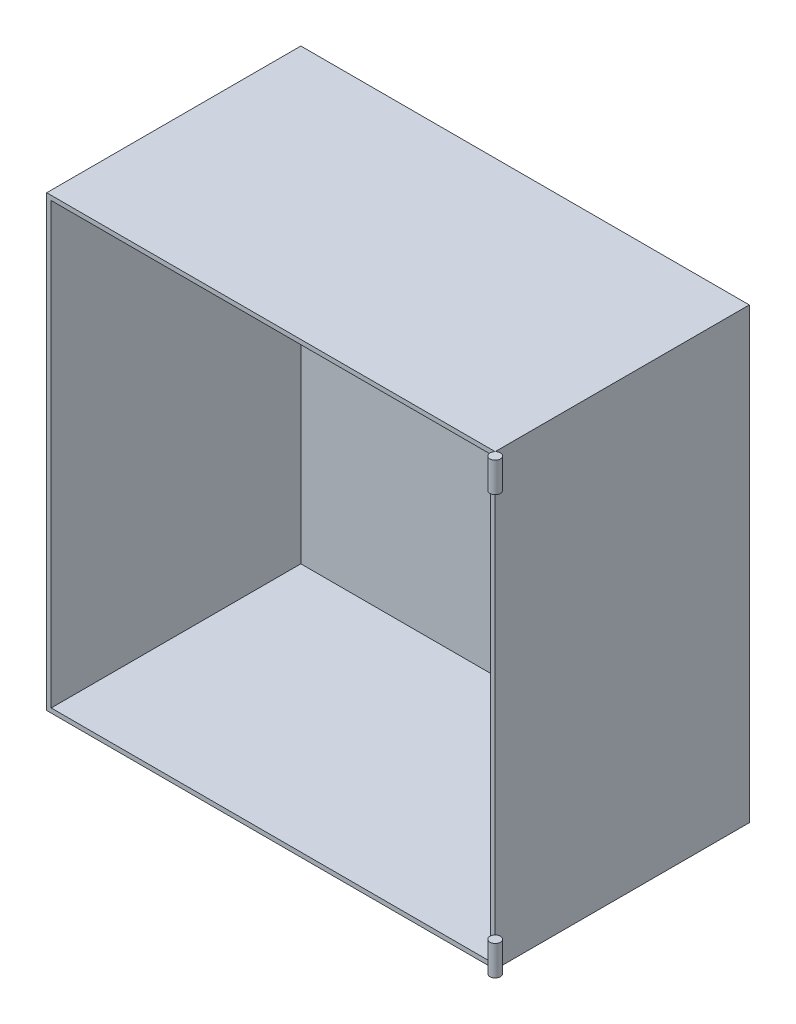
ISO-10303-21;
HEADER;
FILE_DESCRIPTION(('STEP AP214'),'2;1');
FILE_NAME('part.step','',(''),(''),'','','');
FILE_SCHEMA(('AUTOMOTIVE_DESIGN { 1 0 10303 214 1 1 1 1 }'));
ENDSEC;
DATA;
#1=APPLICATION_CONTEXT('core data for automotive mechanical design processes');
#2=APPLICATION_PROTOCOL_DEFINITION('international standard','automotive_design',2000,#1);
#3=PRODUCT_CONTEXT('',#1,'mechanical');
#4=PRODUCT('Part','Part','',(#3));
#5=PRODUCT_RELATED_PRODUCT_CATEGORY('part','',(#4));
#6=PRODUCT_DEFINITION_FORMATION('','',#4);
#7=PRODUCT_DEFINITION_CONTEXT('part definition',#1,'design');
#8=PRODUCT_DEFINITION('design','',#6,#7);
#9=PRODUCT_DEFINITION_SHAPE('','',#8);
#10=(LENGTH_UNIT() NAMED_UNIT(*) SI_UNIT(.MILLI.,.METRE.));
#11=(NAMED_UNIT(*) PLANE_ANGLE_UNIT() SI_UNIT($,.RADIAN.));
#12=(NAMED_UNIT(*) SI_UNIT($,.STERADIAN.) SOLID_ANGLE_UNIT());
#13=UNCERTAINTY_MEASURE_WITH_UNIT(LENGTH_MEASURE(1.E-05),#10,'distance_accuracy_value','');
#14=(GEOMETRIC_REPRESENTATION_CONTEXT(3) GLOBAL_UNCERTAINTY_ASSIGNED_CONTEXT((#13)) GLOBAL_UNIT_ASSIGNED_CONTEXT((#10,
#11,#12)) REPRESENTATION_CONTEXT('',''));
#15=CARTESIAN_POINT('',(0.,0.,0.));
#16=DIRECTION('',(0.,0.,1.));
#17=DIRECTION('',(1.,0.,0.));
#18=AXIS2_PLACEMENT_3D('',#15,#16,#17);
#19=CARTESIAN_POINT('',(302.474873734153,-280.,172.474873734153));
#20=DIRECTION('',(0.,-1.,0.));
#21=DIRECTION('',(1.,0.,0.));
#22=AXIS2_PLACEMENT_3D('',#19,#20,#21);
#23=CYLINDRICAL_SURFACE('',#22,3.49999999999997);
#24=CARTESIAN_POINT('',(302.474873734153,-280.,172.474873734153));
#25=DIRECTION('',(0.,-1.,0.));
#26=DIRECTION('',(1.,0.,0.));
#27=AXIS2_PLACEMENT_3D('',#24,#25,#26);
#28=CIRCLE('',#27,3.49999999999997);
#29=CARTESIAN_POINT('',(305.974873734153,-280.,172.474873734153));
#30=VERTEX_POINT('',#29);
#31=EDGE_CURVE('E11',#30,#30,#28,.T.);
#32=ORIENTED_EDGE('',*,*,#31,.T.);
#33=EDGE_LOOP('',(#32));
#34=FACE_BOUND('',#33,.T.);
#35=CARTESIAN_POINT('',(302.474873734153,-300.,172.474873734153));
#36=DIRECTION('',(0.,-1.,0.));
#37=DIRECTION('',(1.,0.,0.));
#38=AXIS2_PLACEMENT_3D('',#35,#36,#37);
#39=CIRCLE('',#38,3.49999999999997);
#40=CARTESIAN_POINT('',(305.974873734153,-300.,172.474873734153));
#41=VERTEX_POINT('',#40);
#42=EDGE_CURVE('E43',#41,#41,#39,.T.);
#43=ORIENTED_EDGE('',*,*,#42,.F.);
#44=EDGE_LOOP('',(#43));
#45=FACE_BOUND('',#44,.T.);
#46=ADVANCED_FACE('F40',(#34,#45),#23,.T.);
#47=CARTESIAN_POINT('',(302.474873734153,-280.,172.474873734153));
#48=DIRECTION('',(0.,-1.,0.));
#49=DIRECTION('',(1.,0.,0.));
#50=AXIS2_PLACEMENT_3D('',#47,#48,#49);
#51=PLANE('',#50);
#52=ORIENTED_EDGE('',*,*,#31,.F.);
#53=EDGE_LOOP('',(#52));
#54=FACE_BOUND('',#53,.T.);
#55=ADVANCED_FACE('F55',(#54),#51,.F.);
#56=CARTESIAN_POINT('',(302.474873734153,-300.,172.474873734153));
#57=DIRECTION('',(0.,-1.,0.));
#58=DIRECTION('',(1.,0.,0.));
#59=AXIS2_PLACEMENT_3D('',#56,#57,#58);
#60=PLANE('',#59);
#61=ORIENTED_EDGE('',*,*,#42,.T.);
#62=EDGE_LOOP('',(#61));
#63=FACE_BOUND('',#62,.T.);
#64=ADVANCED_FACE('F52',(#63),#60,.T.);
#65=CLOSED_SHELL('',(#46,#55,#64));
#66=MANIFOLD_SOLID_BREP('B2',#65);
#67=CARTESIAN_POINT('',(302.474873734153,-20.,172.474873734153));
#68=DIRECTION('',(0.,1.,0.));
#69=DIRECTION('',(0.,0.,1.));
#70=AXIS2_PLACEMENT_3D('',#67,#68,#69);
#71=CYLINDRICAL_SURFACE('',#70,3.49999999999997);
#72=CARTESIAN_POINT('',(302.474873734153,-20.,172.474873734153));
#73=DIRECTION('',(0.,1.,0.));
#74=DIRECTION('',(0.,0.,1.));
#75=AXIS2_PLACEMENT_3D('',#72,#73,#74);
#76=CIRCLE('',#75,3.49999999999997);
#77=CARTESIAN_POINT('',(302.474873734153,-20.,175.974873734153));
#78=VERTEX_POINT('',#77);
#79=EDGE_CURVE('E39',#78,#78,#76,.T.);
#80=ORIENTED_EDGE('',*,*,#79,.T.);
#81=EDGE_LOOP('',(#80));
#82=FACE_BOUND('',#81,.T.);
#83=CARTESIAN_POINT('',(302.474873734153,0.,172.474873734153));
#84=DIRECTION('',(0.,1.,0.));
#85=DIRECTION('',(0.,0.,1.));
#86=AXIS2_PLACEMENT_3D('',#83,#84,#85);
#87=CIRCLE('',#86,3.49999999999997);
#88=CARTESIAN_POINT('',(302.474873734153,0.,175.974873734153));
#89=VERTEX_POINT('',#88);
#90=EDGE_CURVE('E93',#89,#89,#87,.T.);
#91=ORIENTED_EDGE('',*,*,#90,.F.);
#92=EDGE_LOOP('',(#91));
#93=FACE_BOUND('',#92,.T.);
#94=ADVANCED_FACE('F90',(#82,#93),#71,.T.);
#95=CARTESIAN_POINT('',(302.474873734153,-20.,172.474873734153));
#96=DIRECTION('',(0.,1.,0.));
#97=DIRECTION('',(0.,0.,1.));
#98=AXIS2_PLACEMENT_3D('',#95,#96,#97);
#99=PLANE('',#98);
#100=ORIENTED_EDGE('',*,*,#79,.F.);
#101=EDGE_LOOP('',(#100));
#102=FACE_BOUND('',#101,.T.);
#103=ADVANCED_FACE('F105',(#102),#99,.F.);
#104=CARTESIAN_POINT('',(302.474873734153,0.,172.474873734153));
#105=DIRECTION('',(0.,1.,0.));
#106=DIRECTION('',(0.,0.,1.));
#107=AXIS2_PLACEMENT_3D('',#104,#105,#106);
#108=PLANE('',#107);
#109=ORIENTED_EDGE('',*,*,#90,.T.);
#110=EDGE_LOOP('',(#109));
#111=FACE_BOUND('',#110,.T.);
#112=ADVANCED_FACE('F102',(#111),#108,.T.);
#113=CLOSED_SHELL('',(#94,#103,#112));
#114=MANIFOLD_SOLID_BREP('B6',#113);
#115=CARTESIAN_POINT('',(0.,0.,170.));
#116=DIRECTION('',(1.,0.,0.));
#117=DIRECTION('',(0.,1.,0.));
#118=AXIS2_PLACEMENT_3D('',#115,#116,#117);
#119=PLANE('',#118);
#120=DIRECTION('',(0.,-1.,0.));
#121=VECTOR('',#120,1.);
#122=CARTESIAN_POINT('',(0.,0.,0.));
#123=LINE('',#122,#121);
#124=CARTESIAN_POINT('',(0.,0.,0.));
#125=VERTEX_POINT('',#124);
#126=CARTESIAN_POINT('',(0.,-300.,0.));
#127=VERTEX_POINT('',#126);
#128=EDGE_CURVE('E239',#125,#127,#123,.T.);
#129=ORIENTED_EDGE('',*,*,#128,.T.);
#130=DIRECTION('',(0.,0.,-1.));
#131=VECTOR('',#130,1.);
#132=CARTESIAN_POINT('',(0.,-300.,170.));
#133=LINE('',#132,#131);
#134=CARTESIAN_POINT('',(0.,-300.,170.));
#135=VERTEX_POINT('',#134);
#136=EDGE_CURVE('E88',#135,#127,#133,.T.);
#137=ORIENTED_EDGE('',*,*,#136,.F.);
#138=DIRECTION('',(0.,-1.,0.));
#139=VECTOR('',#138,1.);
#140=CARTESIAN_POINT('',(0.,0.,170.));
#141=LINE('',#140,#139);
#142=CARTESIAN_POINT('',(0.,0.,170.));
#143=VERTEX_POINT('',#142);
#144=EDGE_CURVE('E243',#143,#135,#141,.T.);
#145=ORIENTED_EDGE('',*,*,#144,.F.);
#146=DIRECTION('',(0.,0.,-1.));
#147=VECTOR('',#146,1.);
#148=CARTESIAN_POINT('',(0.,0.,170.));
#149=LINE('',#148,#147);
#150=EDGE_CURVE('E249',#143,#125,#149,.T.);
#151=ORIENTED_EDGE('',*,*,#150,.T.);
#152=EDGE_LOOP('',(#129,#137,#145,#151));
#153=FACE_BOUND('',#152,.T.);
#154=ADVANCED_FACE('F131',(#153),#119,.F.);
#155=CARTESIAN_POINT('',(0.,-300.,170.));
#156=DIRECTION('',(0.,1.,0.));
#157=DIRECTION('',(-1.,0.,0.));
#158=AXIS2_PLACEMENT_3D('',#155,#156,#157);
#159=PLANE('',#158);
#160=DIRECTION('',(1.,0.,0.));
#161=VECTOR('',#160,1.);
#162=CARTESIAN_POINT('',(0.,-300.,0.));
#163=LINE('',#162,#161);
#164=CARTESIAN_POINT('',(300.,-300.,0.));
#165=VERTEX_POINT('',#164);
#166=EDGE_CURVE('E252',#127,#165,#163,.T.);
#167=ORIENTED_EDGE('',*,*,#166,.T.);
#168=DIRECTION('',(0.,0.,-1.));
#169=VECTOR('',#168,1.);
#170=CARTESIAN_POINT('',(300.,-300.,170.));
#171=LINE('',#170,#169);
#172=CARTESIAN_POINT('',(300.,-300.,170.));
#173=VERTEX_POINT('',#172);
#174=EDGE_CURVE('E138',#173,#165,#171,.T.);
#175=ORIENTED_EDGE('',*,*,#174,.F.);
#176=DIRECTION('',(1.,0.,0.));
#177=VECTOR('',#176,1.);
#178=CARTESIAN_POINT('',(0.,-300.,170.));
#179=LINE('',#178,#177);
#180=EDGE_CURVE('E182',#135,#173,#179,.T.);
#181=ORIENTED_EDGE('',*,*,#180,.F.);
#182=ORIENTED_EDGE('',*,*,#136,.T.);
#183=EDGE_LOOP('',(#167,#175,#181,#182));
#184=FACE_BOUND('',#183,.T.);
#185=ADVANCED_FACE('F281',(#184),#159,.F.);
#186=CARTESIAN_POINT('',(300.,0.,170.));
#187=DIRECTION('',(-1.,0.,0.));
#188=DIRECTION('',(0.,-1.,0.));
#189=AXIS2_PLACEMENT_3D('',#186,#187,#188);
#190=PLANE('',#189);
#191=DIRECTION('',(0.,1.,0.));
#192=VECTOR('',#191,1.);
#193=CARTESIAN_POINT('',(300.,0.,0.));
#194=LINE('',#193,#192);
#195=CARTESIAN_POINT('',(300.,0.,0.));
#196=VERTEX_POINT('',#195);
#197=EDGE_CURVE('E254',#165,#196,#194,.T.);
#198=ORIENTED_EDGE('',*,*,#197,.T.);
#199=DIRECTION('',(0.,0.,-1.));
#200=VECTOR('',#199,1.);
#201=CARTESIAN_POINT('',(300.,0.,170.));
#202=LINE('',#201,#200);
#203=CARTESIAN_POINT('',(300.,0.,170.));
#204=VERTEX_POINT('',#203);
#205=EDGE_CURVE('E258',#204,#196,#202,.T.);
#206=ORIENTED_EDGE('',*,*,#205,.F.);
#207=DIRECTION('',(0.,1.,0.));
#208=VECTOR('',#207,1.);
#209=CARTESIAN_POINT('',(300.,0.,170.));
#210=LINE('',#209,#208);
#211=EDGE_CURVE('E246',#173,#204,#210,.T.);
#212=ORIENTED_EDGE('',*,*,#211,.F.);
#213=ORIENTED_EDGE('',*,*,#174,.T.);
#214=EDGE_LOOP('',(#198,#206,#212,#213));
#215=FACE_BOUND('',#214,.T.);
#216=ADVANCED_FACE('F263',(#215),#190,.F.);
#217=CARTESIAN_POINT('',(0.,0.,170.));
#218=DIRECTION('',(0.,-1.,0.));
#219=DIRECTION('',(0.,0.,-1.));
#220=AXIS2_PLACEMENT_3D('',#217,#218,#219);
#221=PLANE('',#220);
#222=DIRECTION('',(-1.,0.,0.));
#223=VECTOR('',#222,1.);
#224=CARTESIAN_POINT('',(0.,0.,0.));
#225=LINE('',#224,#223);
#226=EDGE_CURVE('E175',#196,#125,#225,.T.);
#227=ORIENTED_EDGE('',*,*,#226,.T.);
#228=ORIENTED_EDGE('',*,*,#150,.F.);
#229=DIRECTION('',(-1.,0.,0.));
#230=VECTOR('',#229,1.);
#231=CARTESIAN_POINT('',(0.,0.,170.));
#232=LINE('',#231,#230);
#233=EDGE_CURVE('E154',#204,#143,#232,.T.);
#234=ORIENTED_EDGE('',*,*,#233,.F.);
#235=ORIENTED_EDGE('',*,*,#205,.T.);
#236=EDGE_LOOP('',(#227,#228,#234,#235));
#237=FACE_BOUND('',#236,.T.);
#238=ADVANCED_FACE('F271',(#237),#221,.F.);
#239=CARTESIAN_POINT('',(0.,0.,170.));
#240=DIRECTION('',(0.,0.,1.));
#241=DIRECTION('',(1.,0.,0.));
#242=AXIS2_PLACEMENT_3D('',#239,#240,#241);
#243=PLANE('',#242);
#244=DIRECTION('',(0.,-1.,0.));
#245=VECTOR('',#244,1.);
#246=CARTESIAN_POINT('',(3.,-3.,170.));
#247=LINE('',#246,#245);
#248=CARTESIAN_POINT('',(3.,-3.,170.));
#249=VERTEX_POINT('',#248);
#250=CARTESIAN_POINT('',(3.00000000000004,-297.,170.));
#251=VERTEX_POINT('',#250);
#252=EDGE_CURVE('E145',#249,#251,#247,.T.);
#253=ORIENTED_EDGE('',*,*,#252,.F.);
#254=DIRECTION('',(-1.,0.,0.));
#255=VECTOR('',#254,1.);
#256=CARTESIAN_POINT('',(297.,-3.,170.));
#257=LINE('',#256,#255);
#258=CARTESIAN_POINT('',(297.,-3.,170.));
#259=VERTEX_POINT('',#258);
#260=EDGE_CURVE('E224',#259,#249,#257,.T.);
#261=ORIENTED_EDGE('',*,*,#260,.F.);
#262=DIRECTION('',(0.,1.,0.));
#263=VECTOR('',#262,1.);
#264=CARTESIAN_POINT('',(297.,-297.,170.));
#265=LINE('',#264,#263);
#266=CARTESIAN_POINT('',(297.,-297.,170.));
#267=VERTEX_POINT('',#266);
#268=EDGE_CURVE('E227',#267,#259,#265,.T.);
#269=ORIENTED_EDGE('',*,*,#268,.F.);
#270=DIRECTION('',(1.,0.,0.));
#271=VECTOR('',#270,1.);
#272=CARTESIAN_POINT('',(3.00000000000004,-297.,170.));
#273=LINE('',#272,#271);
#274=EDGE_CURVE('E233',#251,#267,#273,.T.);
#275=ORIENTED_EDGE('',*,*,#274,.F.);
#276=EDGE_LOOP('',(#253,#261,#269,#275));
#277=FACE_BOUND('',#276,.T.);
#278=ORIENTED_EDGE('',*,*,#144,.T.);
#279=ORIENTED_EDGE('',*,*,#180,.T.);
#280=ORIENTED_EDGE('',*,*,#211,.T.);
#281=ORIENTED_EDGE('',*,*,#233,.T.);
#282=EDGE_LOOP('',(#278,#279,#280,#281));
#283=FACE_BOUND('',#282,.T.);
#284=ADVANCED_FACE('F273',(#277,#283),#243,.T.);
#285=CARTESIAN_POINT('',(0.,0.,0.));
#286=DIRECTION('',(0.,0.,1.));
#287=DIRECTION('',(1.,0.,0.));
#288=AXIS2_PLACEMENT_3D('',#285,#286,#287);
#289=PLANE('',#288);
#290=ORIENTED_EDGE('',*,*,#128,.F.);
#291=ORIENTED_EDGE('',*,*,#226,.F.);
#292=ORIENTED_EDGE('',*,*,#197,.F.);
#293=ORIENTED_EDGE('',*,*,#166,.F.);
#294=EDGE_LOOP('',(#290,#291,#292,#293));
#295=FACE_BOUND('',#294,.T.);
#296=ADVANCED_FACE('F267',(#295),#289,.F.);
#297=CARTESIAN_POINT('',(3.,-3.,3.));
#298=DIRECTION('',(-1.,0.,0.));
#299=DIRECTION('',(0.,-1.,0.));
#300=AXIS2_PLACEMENT_3D('',#297,#298,#299);
#301=PLANE('',#300);
#302=ORIENTED_EDGE('',*,*,#252,.T.);
#303=DIRECTION('',(0.,0.,1.));
#304=VECTOR('',#303,1.);
#305=CARTESIAN_POINT('',(3.00000000000004,-297.,3.));
#306=LINE('',#305,#304);
#307=CARTESIAN_POINT('',(3.00000000000004,-297.,3.));
#308=VERTEX_POINT('',#307);
#309=EDGE_CURVE('E202',#308,#251,#306,.T.);
#310=ORIENTED_EDGE('',*,*,#309,.F.);
#311=DIRECTION('',(0.,-1.,0.));
#312=VECTOR('',#311,1.);
#313=CARTESIAN_POINT('',(3.,-3.,3.));
#314=LINE('',#313,#312);
#315=CARTESIAN_POINT('',(3.,-3.,3.));
#316=VERTEX_POINT('',#315);
#317=EDGE_CURVE('E206',#316,#308,#314,.T.);
#318=ORIENTED_EDGE('',*,*,#317,.F.);
#319=DIRECTION('',(0.,0.,1.));
#320=VECTOR('',#319,1.);
#321=CARTESIAN_POINT('',(3.,-3.,3.));
#322=LINE('',#321,#320);
#323=EDGE_CURVE('E237',#316,#249,#322,.T.);
#324=ORIENTED_EDGE('',*,*,#323,.T.);
#325=EDGE_LOOP('',(#302,#310,#318,#324));
#326=FACE_BOUND('',#325,.T.);
#327=ADVANCED_FACE('F204',(#326),#301,.F.);
#328=CARTESIAN_POINT('',(297.,-3.,3.));
#329=DIRECTION('',(0.,1.,0.));
#330=DIRECTION('',(0.,0.,1.));
#331=AXIS2_PLACEMENT_3D('',#328,#329,#330);
#332=PLANE('',#331);
#333=ORIENTED_EDGE('',*,*,#260,.T.);
#334=ORIENTED_EDGE('',*,*,#323,.F.);
#335=DIRECTION('',(-1.,0.,0.));
#336=VECTOR('',#335,1.);
#337=CARTESIAN_POINT('',(297.,-3.,3.));
#338=LINE('',#337,#336);
#339=CARTESIAN_POINT('',(297.,-3.,3.));
#340=VERTEX_POINT('',#339);
#341=EDGE_CURVE('E212',#340,#316,#338,.T.);
#342=ORIENTED_EDGE('',*,*,#341,.F.);
#343=DIRECTION('',(0.,0.,1.));
#344=VECTOR('',#343,1.);
#345=CARTESIAN_POINT('',(297.,-3.,3.));
#346=LINE('',#345,#344);
#347=EDGE_CURVE('E240',#340,#259,#346,.T.);
#348=ORIENTED_EDGE('',*,*,#347,.T.);
#349=EDGE_LOOP('',(#333,#334,#342,#348));
#350=FACE_BOUND('',#349,.T.);
#351=ADVANCED_FACE('F319',(#350),#332,.F.);
#352=CARTESIAN_POINT('',(297.,-297.,3.));
#353=DIRECTION('',(1.,0.,0.));
#354=DIRECTION('',(0.,1.,0.));
#355=AXIS2_PLACEMENT_3D('',#352,#353,#354);
#356=PLANE('',#355);
#357=ORIENTED_EDGE('',*,*,#268,.T.);
#358=ORIENTED_EDGE('',*,*,#347,.F.);
#359=DIRECTION('',(0.,1.,0.));
#360=VECTOR('',#359,1.);
#361=CARTESIAN_POINT('',(297.,-297.,3.));
#362=LINE('',#361,#360);
#363=CARTESIAN_POINT('',(297.,-297.,3.));
#364=VERTEX_POINT('',#363);
#365=EDGE_CURVE('E220',#364,#340,#362,.T.);
#366=ORIENTED_EDGE('',*,*,#365,.F.);
#367=DIRECTION('',(0.,0.,1.));
#368=VECTOR('',#367,1.);
#369=CARTESIAN_POINT('',(297.,-297.,3.));
#370=LINE('',#369,#368);
#371=EDGE_CURVE('E211',#364,#267,#370,.T.);
#372=ORIENTED_EDGE('',*,*,#371,.T.);
#373=EDGE_LOOP('',(#357,#358,#366,#372));
#374=FACE_BOUND('',#373,.T.);
#375=ADVANCED_FACE('F327',(#374),#356,.F.);
#376=CARTESIAN_POINT('',(3.00000000000004,-297.,3.));
#377=DIRECTION('',(0.,-1.,0.));
#378=DIRECTION('',(1.,0.,0.));
#379=AXIS2_PLACEMENT_3D('',#376,#377,#378);
#380=PLANE('',#379);
#381=ORIENTED_EDGE('',*,*,#274,.T.);
#382=ORIENTED_EDGE('',*,*,#371,.F.);
#383=DIRECTION('',(1.,0.,0.));
#384=VECTOR('',#383,1.);
#385=CARTESIAN_POINT('',(3.00000000000004,-297.,3.));
#386=LINE('',#385,#384);
#387=EDGE_CURVE('E215',#308,#364,#386,.T.);
#388=ORIENTED_EDGE('',*,*,#387,.F.);
#389=ORIENTED_EDGE('',*,*,#309,.T.);
#390=EDGE_LOOP('',(#381,#382,#388,#389));
#391=FACE_BOUND('',#390,.T.);
#392=ADVANCED_FACE('F216',(#391),#380,.F.);
#393=CARTESIAN_POINT('',(0.,0.,3.));
#394=DIRECTION('',(0.,0.,1.));
#395=DIRECTION('',(1.,0.,0.));
#396=AXIS2_PLACEMENT_3D('',#393,#394,#395);
#397=PLANE('',#396);
#398=ORIENTED_EDGE('',*,*,#317,.T.);
#399=ORIENTED_EDGE('',*,*,#387,.T.);
#400=ORIENTED_EDGE('',*,*,#365,.T.);
#401=ORIENTED_EDGE('',*,*,#341,.T.);
#402=EDGE_LOOP('',(#398,#399,#400,#401));
#403=FACE_BOUND('',#402,.T.);
#404=ADVANCED_FACE('F222',(#403),#397,.T.);
#405=CLOSED_SHELL('',(#154,#185,#216,#238,#284,#296,#327,#351,#375,#392,#404));
#406=MANIFOLD_SOLID_BREP('B34',#405);
#407=ADVANCED_BREP_SHAPE_REPRESENTATION('',(#18,#66,#114,#406),#14);
#408=SHAPE_DEFINITION_REPRESENTATION(#9,#407);
ENDSEC;
END-ISO-10303-21;
